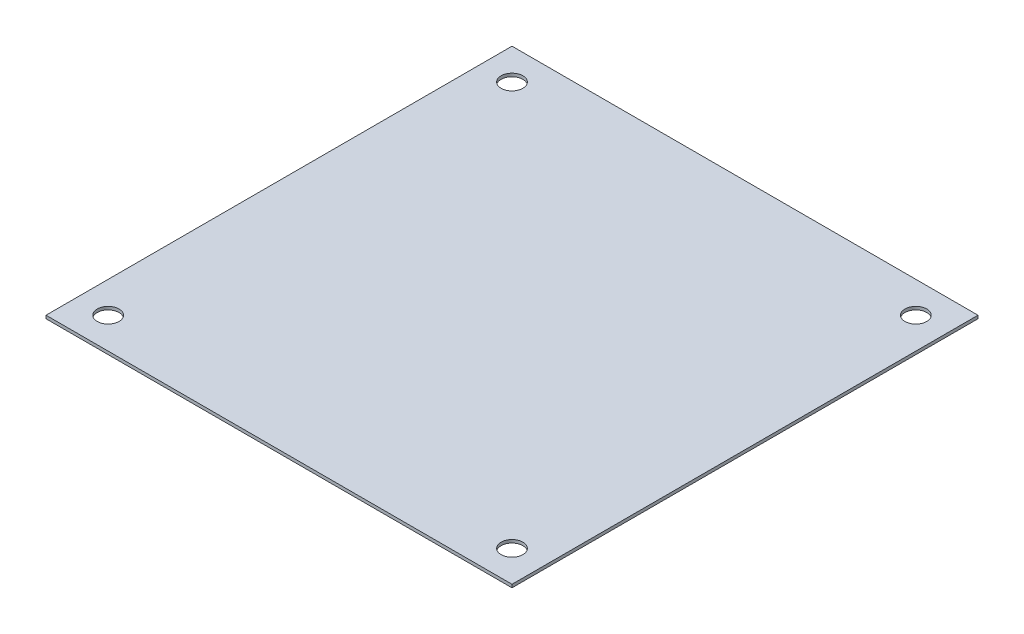
ISO-10303-21;
HEADER;
FILE_DESCRIPTION(('STEP AP214'),'2;1');
FILE_NAME('part.step','',(''),(''),'','','');
FILE_SCHEMA(('AUTOMOTIVE_DESIGN { 1 0 10303 214 1 1 1 1 }'));
ENDSEC;
DATA;
#1=APPLICATION_CONTEXT('core data for automotive mechanical design processes');
#2=APPLICATION_PROTOCOL_DEFINITION('international standard','automotive_design',2000,#1);
#3=PRODUCT_CONTEXT('',#1,'mechanical');
#4=PRODUCT('Part','Part','',(#3));
#5=PRODUCT_RELATED_PRODUCT_CATEGORY('part','',(#4));
#6=PRODUCT_DEFINITION_FORMATION('','',#4);
#7=PRODUCT_DEFINITION_CONTEXT('part definition',#1,'design');
#8=PRODUCT_DEFINITION('design','',#6,#7);
#9=PRODUCT_DEFINITION_SHAPE('','',#8);
#10=(LENGTH_UNIT() NAMED_UNIT(*) SI_UNIT(.MILLI.,.METRE.));
#11=(NAMED_UNIT(*) PLANE_ANGLE_UNIT() SI_UNIT($,.RADIAN.));
#12=(NAMED_UNIT(*) SI_UNIT($,.STERADIAN.) SOLID_ANGLE_UNIT());
#13=UNCERTAINTY_MEASURE_WITH_UNIT(LENGTH_MEASURE(1.E-05),#10,'distance_accuracy_value','');
#14=(GEOMETRIC_REPRESENTATION_CONTEXT(3) GLOBAL_UNCERTAINTY_ASSIGNED_CONTEXT((#13)) GLOBAL_UNIT_ASSIGNED_CONTEXT((#10,
#11,#12)) REPRESENTATION_CONTEXT('',''));
#15=CARTESIAN_POINT('',(0.,0.,0.));
#16=DIRECTION('',(0.,0.,1.));
#17=DIRECTION('',(1.,0.,0.));
#18=AXIS2_PLACEMENT_3D('',#15,#16,#17);
#19=CARTESIAN_POINT('',(75.,1.,75.));
#20=DIRECTION('',(-1.,0.,0.));
#21=DIRECTION('',(0.,0.,1.));
#22=AXIS2_PLACEMENT_3D('',#19,#20,#21);
#23=PLANE('',#22);
#24=DIRECTION('',(0.,0.,-1.));
#25=VECTOR('',#24,1.);
#26=CARTESIAN_POINT('',(75.,0.,75.));
#27=LINE('',#26,#25);
#28=CARTESIAN_POINT('',(75.,0.,75.));
#29=VERTEX_POINT('',#28);
#30=CARTESIAN_POINT('',(75.,0.,-75.));
#31=VERTEX_POINT('',#30);
#32=EDGE_CURVE('E102',#29,#31,#27,.T.);
#33=ORIENTED_EDGE('',*,*,#32,.T.);
#34=DIRECTION('',(0.,-1.,0.));
#35=VECTOR('',#34,1.);
#36=CARTESIAN_POINT('',(75.,1.,-75.));
#37=LINE('',#36,#35);
#38=CARTESIAN_POINT('',(75.,1.,-75.));
#39=VERTEX_POINT('',#38);
#40=EDGE_CURVE('E11',#39,#31,#37,.T.);
#41=ORIENTED_EDGE('',*,*,#40,.F.);
#42=DIRECTION('',(0.,0.,-1.));
#43=VECTOR('',#42,1.);
#44=CARTESIAN_POINT('',(75.,1.,75.));
#45=LINE('',#44,#43);
#46=CARTESIAN_POINT('',(75.,1.,75.));
#47=VERTEX_POINT('',#46);
#48=EDGE_CURVE('E90',#47,#39,#45,.T.);
#49=ORIENTED_EDGE('',*,*,#48,.F.);
#50=DIRECTION('',(0.,-1.,0.));
#51=VECTOR('',#50,1.);
#52=CARTESIAN_POINT('',(75.,1.,75.));
#53=LINE('',#52,#51);
#54=EDGE_CURVE('E98',#47,#29,#53,.T.);
#55=ORIENTED_EDGE('',*,*,#54,.T.);
#56=EDGE_LOOP('',(#33,#41,#49,#55));
#57=FACE_BOUND('',#56,.T.);
#58=ADVANCED_FACE('F39',(#57),#23,.F.);
#59=CARTESIAN_POINT('',(-75.,1.,-75.));
#60=DIRECTION('',(0.,0.,1.));
#61=DIRECTION('',(1.,0.,0.));
#62=AXIS2_PLACEMENT_3D('',#59,#60,#61);
#63=PLANE('',#62);
#64=DIRECTION('',(-1.,0.,0.));
#65=VECTOR('',#64,1.);
#66=CARTESIAN_POINT('',(-75.,0.,-75.));
#67=LINE('',#66,#65);
#68=CARTESIAN_POINT('',(-75.,0.,-75.));
#69=VERTEX_POINT('',#68);
#70=EDGE_CURVE('E94',#31,#69,#67,.T.);
#71=ORIENTED_EDGE('',*,*,#70,.T.);
#72=DIRECTION('',(0.,-1.,0.));
#73=VECTOR('',#72,1.);
#74=CARTESIAN_POINT('',(-75.,1.,-75.));
#75=LINE('',#74,#73);
#76=CARTESIAN_POINT('',(-75.,1.,-75.));
#77=VERTEX_POINT('',#76);
#78=EDGE_CURVE('E47',#77,#69,#75,.T.);
#79=ORIENTED_EDGE('',*,*,#78,.F.);
#80=DIRECTION('',(-1.,0.,0.));
#81=VECTOR('',#80,1.);
#82=CARTESIAN_POINT('',(-75.,1.,-75.));
#83=LINE('',#82,#81);
#84=EDGE_CURVE('E85',#39,#77,#83,.T.);
#85=ORIENTED_EDGE('',*,*,#84,.F.);
#86=ORIENTED_EDGE('',*,*,#40,.T.);
#87=EDGE_LOOP('',(#71,#79,#85,#86));
#88=FACE_BOUND('',#87,.T.);
#89=ADVANCED_FACE('F93',(#88),#63,.F.);
#90=CARTESIAN_POINT('',(-75.,1.,75.));
#91=DIRECTION('',(1.,0.,0.));
#92=DIRECTION('',(0.,0.,-1.));
#93=AXIS2_PLACEMENT_3D('',#90,#91,#92);
#94=PLANE('',#93);
#95=DIRECTION('',(0.,0.,1.));
#96=VECTOR('',#95,1.);
#97=CARTESIAN_POINT('',(-75.,0.,75.));
#98=LINE('',#97,#96);
#99=CARTESIAN_POINT('',(-75.,0.,75.));
#100=VERTEX_POINT('',#99);
#101=EDGE_CURVE('E72',#69,#100,#98,.T.);
#102=ORIENTED_EDGE('',*,*,#101,.T.);
#103=DIRECTION('',(0.,-1.,0.));
#104=VECTOR('',#103,1.);
#105=CARTESIAN_POINT('',(-75.,1.,75.));
#106=LINE('',#105,#104);
#107=CARTESIAN_POINT('',(-75.,1.,75.));
#108=VERTEX_POINT('',#107);
#109=EDGE_CURVE('E95',#108,#100,#106,.T.);
#110=ORIENTED_EDGE('',*,*,#109,.F.);
#111=DIRECTION('',(0.,0.,1.));
#112=VECTOR('',#111,1.);
#113=CARTESIAN_POINT('',(-75.,1.,75.));
#114=LINE('',#113,#112);
#115=EDGE_CURVE('E88',#77,#108,#114,.T.);
#116=ORIENTED_EDGE('',*,*,#115,.F.);
#117=ORIENTED_EDGE('',*,*,#78,.T.);
#118=EDGE_LOOP('',(#102,#110,#116,#117));
#119=FACE_BOUND('',#118,.T.);
#120=ADVANCED_FACE('F96',(#119),#94,.F.);
#121=CARTESIAN_POINT('',(-75.,1.,75.));
#122=DIRECTION('',(0.,0.,-1.));
#123=DIRECTION('',(-1.,0.,0.));
#124=AXIS2_PLACEMENT_3D('',#121,#122,#123);
#125=PLANE('',#124);
#126=DIRECTION('',(1.,0.,0.));
#127=VECTOR('',#126,1.);
#128=CARTESIAN_POINT('',(-75.,0.,75.));
#129=LINE('',#128,#127);
#130=EDGE_CURVE('E78',#100,#29,#129,.T.);
#131=ORIENTED_EDGE('',*,*,#130,.T.);
#132=ORIENTED_EDGE('',*,*,#54,.F.);
#133=DIRECTION('',(1.,0.,0.));
#134=VECTOR('',#133,1.);
#135=CARTESIAN_POINT('',(-75.,1.,75.));
#136=LINE('',#135,#134);
#137=EDGE_CURVE('E55',#108,#47,#136,.T.);
#138=ORIENTED_EDGE('',*,*,#137,.F.);
#139=ORIENTED_EDGE('',*,*,#109,.T.);
#140=EDGE_LOOP('',(#131,#132,#138,#139));
#141=FACE_BOUND('',#140,.T.);
#142=ADVANCED_FACE('F110',(#141),#125,.F.);
#143=CARTESIAN_POINT('',(0.,1.,0.));
#144=DIRECTION('',(0.,-1.,0.));
#145=DIRECTION('',(0.,0.,-1.));
#146=AXIS2_PLACEMENT_3D('',#143,#144,#145);
#147=PLANE('',#146);
#148=CARTESIAN_POINT('',(65.,1.,65.));
#149=DIRECTION('',(0.,1.,0.));
#150=DIRECTION('',(0.,0.,1.));
#151=AXIS2_PLACEMENT_3D('',#148,#149,#150);
#152=CIRCLE('',#151,3.50000000000001);
#153=CARTESIAN_POINT('',(65.,1.,68.5));
#154=VERTEX_POINT('',#153);
#155=EDGE_CURVE('E136',#154,#154,#152,.T.);
#156=ORIENTED_EDGE('',*,*,#155,.F.);
#157=EDGE_LOOP('',(#156));
#158=FACE_BOUND('',#157,.T.);
#159=CARTESIAN_POINT('',(65.,1.,-65.));
#160=DIRECTION('',(0.,1.,0.));
#161=DIRECTION('',(0.,0.,1.));
#162=AXIS2_PLACEMENT_3D('',#159,#160,#161);
#163=CIRCLE('',#162,3.50000000000001);
#164=CARTESIAN_POINT('',(65.,1.,-61.5));
#165=VERTEX_POINT('',#164);
#166=EDGE_CURVE('E130',#165,#165,#163,.T.);
#167=ORIENTED_EDGE('',*,*,#166,.F.);
#168=EDGE_LOOP('',(#167));
#169=FACE_BOUND('',#168,.T.);
#170=CARTESIAN_POINT('',(-65.,1.,-65.));
#171=DIRECTION('',(0.,1.,0.));
#172=DIRECTION('',(0.,0.,1.));
#173=AXIS2_PLACEMENT_3D('',#170,#171,#172);
#174=CIRCLE('',#173,3.5);
#175=CARTESIAN_POINT('',(-65.,1.,-61.5));
#176=VERTEX_POINT('',#175);
#177=EDGE_CURVE('E124',#176,#176,#174,.T.);
#178=ORIENTED_EDGE('',*,*,#177,.F.);
#179=EDGE_LOOP('',(#178));
#180=FACE_BOUND('',#179,.T.);
#181=CARTESIAN_POINT('',(-65.,1.,65.));
#182=DIRECTION('',(0.,1.,0.));
#183=DIRECTION('',(0.,0.,1.));
#184=AXIS2_PLACEMENT_3D('',#181,#182,#183);
#185=CIRCLE('',#184,3.5);
#186=CARTESIAN_POINT('',(-65.,1.,68.5));
#187=VERTEX_POINT('',#186);
#188=EDGE_CURVE('E118',#187,#187,#185,.T.);
#189=ORIENTED_EDGE('',*,*,#188,.F.);
#190=EDGE_LOOP('',(#189));
#191=FACE_BOUND('',#190,.T.);
#192=ORIENTED_EDGE('',*,*,#48,.T.);
#193=ORIENTED_EDGE('',*,*,#84,.T.);
#194=ORIENTED_EDGE('',*,*,#115,.T.);
#195=ORIENTED_EDGE('',*,*,#137,.T.);
#196=EDGE_LOOP('',(#192,#193,#194,#195));
#197=FACE_BOUND('',#196,.T.);
#198=ADVANCED_FACE('F86',(#158,#169,#180,#191,#197),#147,.F.);
#199=CARTESIAN_POINT('',(0.,0.,0.));
#200=DIRECTION('',(0.,-1.,0.));
#201=DIRECTION('',(0.,0.,-1.));
#202=AXIS2_PLACEMENT_3D('',#199,#200,#201);
#203=PLANE('',#202);
#204=CARTESIAN_POINT('',(65.,0.,65.));
#205=DIRECTION('',(0.,-1.,0.));
#206=DIRECTION('',(0.,0.,-1.));
#207=AXIS2_PLACEMENT_3D('',#204,#205,#206);
#208=CIRCLE('',#207,3.50000000000001);
#209=CARTESIAN_POINT('',(65.,0.,61.5));
#210=VERTEX_POINT('',#209);
#211=EDGE_CURVE('E133',#210,#210,#208,.F.);
#212=ORIENTED_EDGE('',*,*,#211,.T.);
#213=EDGE_LOOP('',(#212));
#214=FACE_BOUND('',#213,.T.);
#215=CARTESIAN_POINT('',(65.,0.,-65.));
#216=DIRECTION('',(0.,-1.,0.));
#217=DIRECTION('',(0.,0.,-1.));
#218=AXIS2_PLACEMENT_3D('',#215,#216,#217);
#219=CIRCLE('',#218,3.50000000000001);
#220=CARTESIAN_POINT('',(65.,0.,-68.5));
#221=VERTEX_POINT('',#220);
#222=EDGE_CURVE('E127',#221,#221,#219,.F.);
#223=ORIENTED_EDGE('',*,*,#222,.T.);
#224=EDGE_LOOP('',(#223));
#225=FACE_BOUND('',#224,.T.);
#226=CARTESIAN_POINT('',(-65.,0.,-65.));
#227=DIRECTION('',(0.,-1.,0.));
#228=DIRECTION('',(0.,0.,-1.));
#229=AXIS2_PLACEMENT_3D('',#226,#227,#228);
#230=CIRCLE('',#229,3.5);
#231=CARTESIAN_POINT('',(-65.,0.,-68.5));
#232=VERTEX_POINT('',#231);
#233=EDGE_CURVE('E121',#232,#232,#230,.F.);
#234=ORIENTED_EDGE('',*,*,#233,.T.);
#235=EDGE_LOOP('',(#234));
#236=FACE_BOUND('',#235,.T.);
#237=CARTESIAN_POINT('',(-65.,0.,65.));
#238=DIRECTION('',(0.,-1.,0.));
#239=DIRECTION('',(0.,0.,-1.));
#240=AXIS2_PLACEMENT_3D('',#237,#238,#239);
#241=CIRCLE('',#240,3.5);
#242=CARTESIAN_POINT('',(-65.,0.,61.5));
#243=VERTEX_POINT('',#242);
#244=EDGE_CURVE('E105',#243,#243,#241,.F.);
#245=ORIENTED_EDGE('',*,*,#244,.T.);
#246=EDGE_LOOP('',(#245));
#247=FACE_BOUND('',#246,.T.);
#248=ORIENTED_EDGE('',*,*,#32,.F.);
#249=ORIENTED_EDGE('',*,*,#130,.F.);
#250=ORIENTED_EDGE('',*,*,#101,.F.);
#251=ORIENTED_EDGE('',*,*,#70,.F.);
#252=EDGE_LOOP('',(#248,#249,#250,#251));
#253=FACE_BOUND('',#252,.T.);
#254=ADVANCED_FACE('F113',(#214,#225,#236,#247,#253),#203,.T.);
#255=CARTESIAN_POINT('',(-65.,-9.89949493661168,65.));
#256=DIRECTION('',(0.,1.,0.));
#257=DIRECTION('',(0.,0.,1.));
#258=AXIS2_PLACEMENT_3D('',#255,#256,#257);
#259=CYLINDRICAL_SURFACE('',#258,3.5);
#260=ORIENTED_EDGE('',*,*,#188,.T.);
#261=EDGE_LOOP('',(#260));
#262=FACE_BOUND('',#261,.T.);
#263=ORIENTED_EDGE('',*,*,#244,.F.);
#264=EDGE_LOOP('',(#263));
#265=FACE_BOUND('',#264,.T.);
#266=ADVANCED_FACE('F152',(#262,#265),#259,.F.);
#267=CARTESIAN_POINT('',(-65.,-9.89949493661168,-65.));
#268=DIRECTION('',(0.,1.,0.));
#269=DIRECTION('',(0.,0.,1.));
#270=AXIS2_PLACEMENT_3D('',#267,#268,#269);
#271=CYLINDRICAL_SURFACE('',#270,3.5);
#272=ORIENTED_EDGE('',*,*,#177,.T.);
#273=EDGE_LOOP('',(#272));
#274=FACE_BOUND('',#273,.T.);
#275=ORIENTED_EDGE('',*,*,#233,.F.);
#276=EDGE_LOOP('',(#275));
#277=FACE_BOUND('',#276,.T.);
#278=ADVANCED_FACE('F155',(#274,#277),#271,.F.);
#279=CARTESIAN_POINT('',(65.,-9.89949493661168,-65.));
#280=DIRECTION('',(0.,1.,0.));
#281=DIRECTION('',(0.,0.,1.));
#282=AXIS2_PLACEMENT_3D('',#279,#280,#281);
#283=CYLINDRICAL_SURFACE('',#282,3.50000000000001);
#284=ORIENTED_EDGE('',*,*,#166,.T.);
#285=EDGE_LOOP('',(#284));
#286=FACE_BOUND('',#285,.T.);
#287=ORIENTED_EDGE('',*,*,#222,.F.);
#288=EDGE_LOOP('',(#287));
#289=FACE_BOUND('',#288,.T.);
#290=ADVANCED_FACE('F205',(#286,#289),#283,.F.);
#291=CARTESIAN_POINT('',(65.,-9.89949493661168,65.));
#292=DIRECTION('',(0.,1.,0.));
#293=DIRECTION('',(0.,0.,1.));
#294=AXIS2_PLACEMENT_3D('',#291,#292,#293);
#295=CYLINDRICAL_SURFACE('',#294,3.50000000000001);
#296=ORIENTED_EDGE('',*,*,#155,.T.);
#297=EDGE_LOOP('',(#296));
#298=FACE_BOUND('',#297,.T.);
#299=ORIENTED_EDGE('',*,*,#211,.F.);
#300=EDGE_LOOP('',(#299));
#301=FACE_BOUND('',#300,.T.);
#302=ADVANCED_FACE('F140',(#298,#301),#295,.F.);
#303=CLOSED_SHELL('',(#58,#89,#120,#142,#198,#254,#266,#278,#290,#302));
#304=MANIFOLD_SOLID_BREP('B2',#303);
#305=ADVANCED_BREP_SHAPE_REPRESENTATION('',(#18,#304),#14);
#306=SHAPE_DEFINITION_REPRESENTATION(#9,#305);
ENDSEC;
END-ISO-10303-21;
